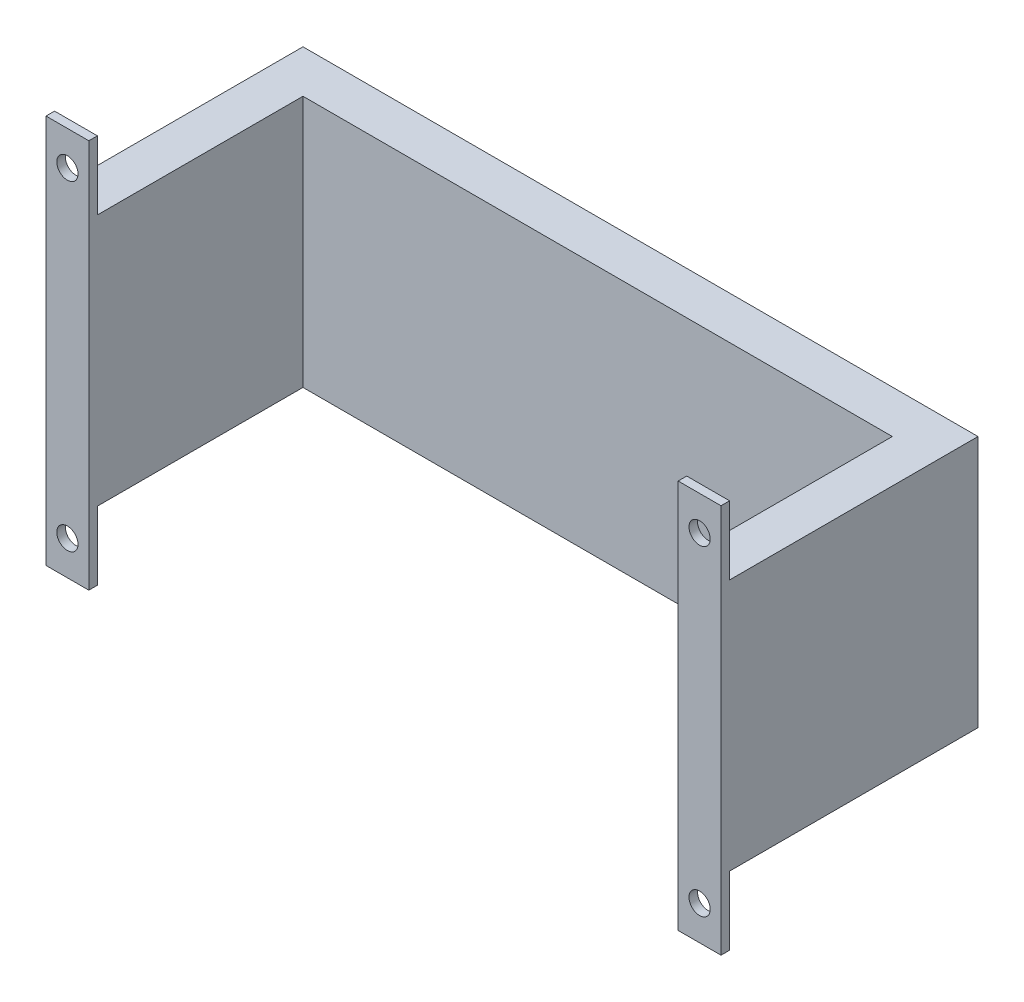
ISO-10303-21;
HEADER;
FILE_DESCRIPTION(('STEP AP214'),'2;1');
FILE_NAME('part.step','',(''),(''),'','','');
FILE_SCHEMA(('AUTOMOTIVE_DESIGN { 1 0 10303 214 1 1 1 1 }'));
ENDSEC;
DATA;
#1=APPLICATION_CONTEXT('core data for automotive mechanical design processes');
#2=APPLICATION_PROTOCOL_DEFINITION('international standard','automotive_design',2000,#1);
#3=PRODUCT_CONTEXT('',#1,'mechanical');
#4=PRODUCT('Part','Part','',(#3));
#5=PRODUCT_RELATED_PRODUCT_CATEGORY('part','',(#4));
#6=PRODUCT_DEFINITION_FORMATION('','',#4);
#7=PRODUCT_DEFINITION_CONTEXT('part definition',#1,'design');
#8=PRODUCT_DEFINITION('design','',#6,#7);
#9=PRODUCT_DEFINITION_SHAPE('','',#8);
#10=(LENGTH_UNIT() NAMED_UNIT(*) SI_UNIT(.MILLI.,.METRE.));
#11=(NAMED_UNIT(*) PLANE_ANGLE_UNIT() SI_UNIT($,.RADIAN.));
#12=(NAMED_UNIT(*) SI_UNIT($,.STERADIAN.) SOLID_ANGLE_UNIT());
#13=UNCERTAINTY_MEASURE_WITH_UNIT(LENGTH_MEASURE(1.E-05),#10,'distance_accuracy_value','');
#14=(GEOMETRIC_REPRESENTATION_CONTEXT(3) GLOBAL_UNCERTAINTY_ASSIGNED_CONTEXT((#13)) GLOBAL_UNIT_ASSIGNED_CONTEXT((#10,
#11,#12)) REPRESENTATION_CONTEXT('',''));
#15=CARTESIAN_POINT('',(0.,0.,0.));
#16=DIRECTION('',(0.,0.,1.));
#17=DIRECTION('',(1.,0.,0.));
#18=AXIS2_PLACEMENT_3D('',#15,#16,#17);
#19=CARTESIAN_POINT('',(0.,0.,95.25));
#20=DIRECTION('',(0.,0.,1.));
#21=DIRECTION('',(1.,0.,0.));
#22=AXIS2_PLACEMENT_3D('',#19,#20,#21);
#23=PLANE('',#22);
#24=CARTESIAN_POINT('',(-117.1575,-59.436,95.25));
#25=DIRECTION('',(0.,0.,-1.));
#26=DIRECTION('',(1.,0.,0.));
#27=AXIS2_PLACEMENT_3D('',#24,#25,#26);
#28=CIRCLE('',#27,3.937);
#29=CARTESIAN_POINT('',(-113.2205,-59.436,95.25));
#30=VERTEX_POINT('',#29);
#31=EDGE_CURVE('E428',#30,#30,#28,.T.);
#32=ORIENTED_EDGE('',*,*,#31,.T.);
#33=EDGE_LOOP('',(#32));
#34=FACE_BOUND('',#33,.T.);
#35=CARTESIAN_POINT('',(-117.1575,59.436,95.25));
#36=DIRECTION('',(0.,0.,-1.));
#37=DIRECTION('',(-1.,0.,0.));
#38=AXIS2_PLACEMENT_3D('',#35,#36,#37);
#39=CIRCLE('',#38,3.937);
#40=CARTESIAN_POINT('',(-121.0945,59.436,95.25));
#41=VERTEX_POINT('',#40);
#42=EDGE_CURVE('E180',#41,#41,#39,.T.);
#43=ORIENTED_EDGE('',*,*,#42,.T.);
#44=EDGE_LOOP('',(#43));
#45=FACE_BOUND('',#44,.T.);
#46=DIRECTION('',(0.,-1.,0.));
#47=VECTOR('',#46,1.);
#48=CARTESIAN_POINT('',(-109.22,-46.736,95.25));
#49=LINE('',#48,#47);
#50=CARTESIAN_POINT('',(-109.22,72.136,95.25));
#51=VERTEX_POINT('',#50);
#52=CARTESIAN_POINT('',(-109.22,-72.136,95.25));
#53=VERTEX_POINT('',#52);
#54=EDGE_CURVE('E272',#51,#53,#49,.T.);
#55=ORIENTED_EDGE('',*,*,#54,.F.);
#56=DIRECTION('',(-1.,0.,0.));
#57=VECTOR('',#56,1.);
#58=CARTESIAN_POINT('',(-109.22,72.136,95.25));
#59=LINE('',#58,#57);
#60=CARTESIAN_POINT('',(-125.095,72.136,95.25));
#61=VERTEX_POINT('',#60);
#62=EDGE_CURVE('E166',#51,#61,#59,.T.);
#63=ORIENTED_EDGE('',*,*,#62,.T.);
#64=DIRECTION('',(0.,-1.,0.));
#65=VECTOR('',#64,1.);
#66=CARTESIAN_POINT('',(-125.095,-46.736,95.25));
#67=LINE('',#66,#65);
#68=CARTESIAN_POINT('',(-125.095,-72.136,95.25));
#69=VERTEX_POINT('',#68);
#70=EDGE_CURVE('E161',#61,#69,#67,.T.);
#71=ORIENTED_EDGE('',*,*,#70,.T.);
#72=DIRECTION('',(1.,0.,0.));
#73=VECTOR('',#72,1.);
#74=CARTESIAN_POINT('',(-109.22,-72.136,95.25));
#75=LINE('',#74,#73);
#76=EDGE_CURVE('E164',#69,#53,#75,.T.);
#77=ORIENTED_EDGE('',*,*,#76,.T.);
#78=EDGE_LOOP('',(#55,#63,#71,#77));
#79=FACE_BOUND('',#78,.T.);
#80=ADVANCED_FACE('F45',(#34,#45,#79),#23,.T.);
#81=CARTESIAN_POINT('',(-125.095,-46.736,95.25));
#82=DIRECTION('',(1.,0.,0.));
#83=DIRECTION('',(0.,0.,-1.));
#84=AXIS2_PLACEMENT_3D('',#81,#82,#83);
#85=PLANE('',#84);
#86=DIRECTION('',(0.,-1.,0.));
#87=VECTOR('',#86,1.);
#88=CARTESIAN_POINT('',(-125.095,-46.736,0.));
#89=LINE('',#88,#87);
#90=CARTESIAN_POINT('',(-125.095,46.736,0.));
#91=VERTEX_POINT('',#90);
#92=CARTESIAN_POINT('',(-125.095,-46.736,0.));
#93=VERTEX_POINT('',#92);
#94=EDGE_CURVE('E302',#91,#93,#89,.T.);
#95=ORIENTED_EDGE('',*,*,#94,.T.);
#96=DIRECTION('',(0.,0.,-1.));
#97=VECTOR('',#96,1.);
#98=CARTESIAN_POINT('',(-125.095,-46.736,95.25));
#99=LINE('',#98,#97);
#100=CARTESIAN_POINT('',(-125.095,-46.736,92.075));
#101=VERTEX_POINT('',#100);
#102=EDGE_CURVE('E11',#101,#93,#99,.T.);
#103=ORIENTED_EDGE('',*,*,#102,.F.);
#104=DIRECTION('',(0.,-1.,0.));
#105=VECTOR('',#104,1.);
#106=CARTESIAN_POINT('',(-125.095,-72.136,92.075));
#107=LINE('',#106,#105);
#108=CARTESIAN_POINT('',(-125.095,-72.136,92.075));
#109=VERTEX_POINT('',#108);
#110=EDGE_CURVE('E69',#101,#109,#107,.T.);
#111=ORIENTED_EDGE('',*,*,#110,.T.);
#112=DIRECTION('',(0.,0.,1.));
#113=VECTOR('',#112,1.);
#114=CARTESIAN_POINT('',(-125.095,-72.136,92.075));
#115=LINE('',#114,#113);
#116=EDGE_CURVE('E173',#109,#69,#115,.T.);
#117=ORIENTED_EDGE('',*,*,#116,.T.);
#118=ORIENTED_EDGE('',*,*,#70,.F.);
#119=DIRECTION('',(0.,0.,1.));
#120=VECTOR('',#119,1.);
#121=CARTESIAN_POINT('',(-125.095,72.136,92.075));
#122=LINE('',#121,#120);
#123=CARTESIAN_POINT('',(-125.095,72.136,92.075));
#124=VERTEX_POINT('',#123);
#125=EDGE_CURVE('E210',#124,#61,#122,.T.);
#126=ORIENTED_EDGE('',*,*,#125,.F.);
#127=DIRECTION('',(0.,-1.,0.));
#128=VECTOR('',#127,1.);
#129=CARTESIAN_POINT('',(-125.095,72.136,92.075));
#130=LINE('',#129,#128);
#131=CARTESIAN_POINT('',(-125.095,46.736,92.075));
#132=VERTEX_POINT('',#131);
#133=EDGE_CURVE('E221',#124,#132,#130,.T.);
#134=ORIENTED_EDGE('',*,*,#133,.T.);
#135=DIRECTION('',(0.,0.,-1.));
#136=VECTOR('',#135,1.);
#137=CARTESIAN_POINT('',(-125.095,46.736,95.25));
#138=LINE('',#137,#136);
#139=EDGE_CURVE('E316',#132,#91,#138,.T.);
#140=ORIENTED_EDGE('',*,*,#139,.T.);
#141=EDGE_LOOP('',(#95,#103,#111,#117,#118,#126,#134,#140));
#142=FACE_BOUND('',#141,.T.);
#143=ADVANCED_FACE('F47',(#142),#85,.F.);
#144=CARTESIAN_POINT('',(125.095,-46.736,95.25));
#145=DIRECTION('',(0.,1.,0.));
#146=DIRECTION('',(-1.,0.,0.));
#147=AXIS2_PLACEMENT_3D('',#144,#145,#146);
#148=PLANE('',#147);
#149=DIRECTION('',(0.,0.,-1.));
#150=VECTOR('',#149,1.);
#151=CARTESIAN_POINT('',(125.095,-46.736,95.25));
#152=LINE('',#151,#150);
#153=CARTESIAN_POINT('',(125.095,-46.736,92.075));
#154=VERTEX_POINT('',#153);
#155=CARTESIAN_POINT('',(125.095,-46.736,0.));
#156=VERTEX_POINT('',#155);
#157=EDGE_CURVE('E54',#154,#156,#152,.T.);
#158=ORIENTED_EDGE('',*,*,#157,.F.);
#159=DIRECTION('',(-1.,0.,0.));
#160=VECTOR('',#159,1.);
#161=CARTESIAN_POINT('',(109.22,-46.736,92.075));
#162=LINE('',#161,#160);
#163=CARTESIAN_POINT('',(109.22,-46.736,92.075));
#164=VERTEX_POINT('',#163);
#165=EDGE_CURVE('E233',#154,#164,#162,.T.);
#166=ORIENTED_EDGE('',*,*,#165,.T.);
#167=DIRECTION('',(0.,0.,1.));
#168=VECTOR('',#167,1.);
#169=CARTESIAN_POINT('',(109.22,-46.736,15.875));
#170=LINE('',#169,#168);
#171=CARTESIAN_POINT('',(109.22,-46.736,15.875));
#172=VERTEX_POINT('',#171);
#173=EDGE_CURVE('E307',#172,#164,#170,.T.);
#174=ORIENTED_EDGE('',*,*,#173,.F.);
#175=DIRECTION('',(1.,0.,0.));
#176=VECTOR('',#175,1.);
#177=CARTESIAN_POINT('',(109.22,-46.736,15.875));
#178=LINE('',#177,#176);
#179=CARTESIAN_POINT('',(-109.22,-46.736,15.875));
#180=VERTEX_POINT('',#179);
#181=EDGE_CURVE('E280',#180,#172,#178,.T.);
#182=ORIENTED_EDGE('',*,*,#181,.F.);
#183=DIRECTION('',(0.,0.,1.));
#184=VECTOR('',#183,1.);
#185=CARTESIAN_POINT('',(-109.22,-46.736,15.875));
#186=LINE('',#185,#184);
#187=CARTESIAN_POINT('',(-109.22,-46.736,92.075));
#188=VERTEX_POINT('',#187);
#189=EDGE_CURVE('E293',#180,#188,#186,.T.);
#190=ORIENTED_EDGE('',*,*,#189,.T.);
#191=DIRECTION('',(-1.,0.,0.));
#192=VECTOR('',#191,1.);
#193=CARTESIAN_POINT('',(-109.22,-46.736,92.075));
#194=LINE('',#193,#192);
#195=EDGE_CURVE('E199',#188,#101,#194,.T.);
#196=ORIENTED_EDGE('',*,*,#195,.T.);
#197=ORIENTED_EDGE('',*,*,#102,.T.);
#198=DIRECTION('',(1.,0.,0.));
#199=VECTOR('',#198,1.);
#200=CARTESIAN_POINT('',(125.095,-46.736,0.));
#201=LINE('',#200,#199);
#202=EDGE_CURVE('E319',#93,#156,#201,.T.);
#203=ORIENTED_EDGE('',*,*,#202,.T.);
#204=EDGE_LOOP('',(#158,#166,#174,#182,#190,#196,#197,#203));
#205=FACE_BOUND('',#204,.T.);
#206=ADVANCED_FACE('F344',(#205),#148,.F.);
#207=CARTESIAN_POINT('',(125.095,-46.736,95.25));
#208=DIRECTION('',(-1.,0.,0.));
#209=DIRECTION('',(0.,0.,1.));
#210=AXIS2_PLACEMENT_3D('',#207,#208,#209);
#211=PLANE('',#210);
#212=DIRECTION('',(0.,1.,0.));
#213=VECTOR('',#212,1.);
#214=CARTESIAN_POINT('',(125.095,-46.736,0.));
#215=LINE('',#214,#213);
#216=CARTESIAN_POINT('',(125.095,46.736,0.));
#217=VERTEX_POINT('',#216);
#218=EDGE_CURVE('E323',#156,#217,#215,.T.);
#219=ORIENTED_EDGE('',*,*,#218,.T.);
#220=DIRECTION('',(0.,0.,-1.));
#221=VECTOR('',#220,1.);
#222=CARTESIAN_POINT('',(125.095,46.736,95.25));
#223=LINE('',#222,#221);
#224=CARTESIAN_POINT('',(125.095,46.736,92.075));
#225=VERTEX_POINT('',#224);
#226=EDGE_CURVE('E332',#225,#217,#223,.T.);
#227=ORIENTED_EDGE('',*,*,#226,.F.);
#228=DIRECTION('',(0.,1.,0.));
#229=VECTOR('',#228,1.);
#230=CARTESIAN_POINT('',(125.095,72.136,92.075));
#231=LINE('',#230,#229);
#232=CARTESIAN_POINT('',(125.095,72.136,92.075));
#233=VERTEX_POINT('',#232);
#234=EDGE_CURVE('E249',#225,#233,#231,.T.);
#235=ORIENTED_EDGE('',*,*,#234,.T.);
#236=DIRECTION('',(0.,0.,1.));
#237=VECTOR('',#236,1.);
#238=CARTESIAN_POINT('',(125.095,72.136,92.075));
#239=LINE('',#238,#237);
#240=CARTESIAN_POINT('',(125.095,72.136,95.25));
#241=VERTEX_POINT('',#240);
#242=EDGE_CURVE('E264',#233,#241,#239,.T.);
#243=ORIENTED_EDGE('',*,*,#242,.T.);
#244=DIRECTION('',(0.,1.,0.));
#245=VECTOR('',#244,1.);
#246=CARTESIAN_POINT('',(125.095,-46.736,95.25));
#247=LINE('',#246,#245);
#248=CARTESIAN_POINT('',(125.095,-72.136,95.25));
#249=VERTEX_POINT('',#248);
#250=EDGE_CURVE('E170',#249,#241,#247,.T.);
#251=ORIENTED_EDGE('',*,*,#250,.F.);
#252=DIRECTION('',(0.,0.,1.));
#253=VECTOR('',#252,1.);
#254=CARTESIAN_POINT('',(125.095,-72.136,92.075));
#255=LINE('',#254,#253);
#256=CARTESIAN_POINT('',(125.095,-72.136,92.075));
#257=VERTEX_POINT('',#256);
#258=EDGE_CURVE('E185',#257,#249,#255,.T.);
#259=ORIENTED_EDGE('',*,*,#258,.F.);
#260=DIRECTION('',(0.,1.,0.));
#261=VECTOR('',#260,1.);
#262=CARTESIAN_POINT('',(125.095,-72.136,92.075));
#263=LINE('',#262,#261);
#264=EDGE_CURVE('E240',#257,#154,#263,.T.);
#265=ORIENTED_EDGE('',*,*,#264,.T.);
#266=ORIENTED_EDGE('',*,*,#157,.T.);
#267=EDGE_LOOP('',(#219,#227,#235,#243,#251,#259,#265,#266));
#268=FACE_BOUND('',#267,.T.);
#269=ADVANCED_FACE('F337',(#268),#211,.F.);
#270=CARTESIAN_POINT('',(125.095,46.736,95.25));
#271=DIRECTION('',(0.,-1.,0.));
#272=DIRECTION('',(1.,0.,0.));
#273=AXIS2_PLACEMENT_3D('',#270,#271,#272);
#274=PLANE('',#273);
#275=ORIENTED_EDGE('',*,*,#139,.F.);
#276=DIRECTION('',(1.,0.,0.));
#277=VECTOR('',#276,1.);
#278=CARTESIAN_POINT('',(-109.22,46.736,92.075));
#279=LINE('',#278,#277);
#280=CARTESIAN_POINT('',(-109.22,46.736,92.075));
#281=VERTEX_POINT('',#280);
#282=EDGE_CURVE('E209',#132,#281,#279,.T.);
#283=ORIENTED_EDGE('',*,*,#282,.T.);
#284=DIRECTION('',(0.,0.,1.));
#285=VECTOR('',#284,1.);
#286=CARTESIAN_POINT('',(-109.22,46.736,15.875));
#287=LINE('',#286,#285);
#288=CARTESIAN_POINT('',(-109.22,46.736,15.875));
#289=VERTEX_POINT('',#288);
#290=EDGE_CURVE('E298',#289,#281,#287,.T.);
#291=ORIENTED_EDGE('',*,*,#290,.F.);
#292=DIRECTION('',(-1.,0.,0.));
#293=VECTOR('',#292,1.);
#294=CARTESIAN_POINT('',(109.22,46.736,15.875));
#295=LINE('',#294,#293);
#296=CARTESIAN_POINT('',(109.22,46.736,15.875));
#297=VERTEX_POINT('',#296);
#298=EDGE_CURVE('E289',#297,#289,#295,.T.);
#299=ORIENTED_EDGE('',*,*,#298,.F.);
#300=DIRECTION('',(0.,0.,1.));
#301=VECTOR('',#300,1.);
#302=CARTESIAN_POINT('',(109.22,46.736,15.875));
#303=LINE('',#302,#301);
#304=CARTESIAN_POINT('',(109.22,46.736,92.075));
#305=VERTEX_POINT('',#304);
#306=EDGE_CURVE('E303',#297,#305,#303,.T.);
#307=ORIENTED_EDGE('',*,*,#306,.T.);
#308=DIRECTION('',(1.,0.,0.));
#309=VECTOR('',#308,1.);
#310=CARTESIAN_POINT('',(109.22,46.736,92.075));
#311=LINE('',#310,#309);
#312=EDGE_CURVE('E260',#305,#225,#311,.T.);
#313=ORIENTED_EDGE('',*,*,#312,.T.);
#314=ORIENTED_EDGE('',*,*,#226,.T.);
#315=DIRECTION('',(-1.,0.,0.));
#316=VECTOR('',#315,1.);
#317=CARTESIAN_POINT('',(125.095,46.736,0.));
#318=LINE('',#317,#316);
#319=EDGE_CURVE('E171',#217,#91,#318,.T.);
#320=ORIENTED_EDGE('',*,*,#319,.T.);
#321=EDGE_LOOP('',(#275,#283,#291,#299,#307,#313,#314,#320));
#322=FACE_BOUND('',#321,.T.);
#323=ADVANCED_FACE('F350',(#322),#274,.F.);
#324=CARTESIAN_POINT('',(117.1575,59.436,95.25));
#325=DIRECTION('',(0.,0.,-1.));
#326=DIRECTION('',(1.,0.,0.));
#327=AXIS2_PLACEMENT_3D('',#324,#325,#326);
#328=CIRCLE('',#327,3.937);
#329=CARTESIAN_POINT('',(121.0945,59.436,95.25));
#330=VERTEX_POINT('',#329);
#331=EDGE_CURVE('E418',#330,#330,#328,.T.);
#332=ORIENTED_EDGE('',*,*,#331,.T.);
#333=EDGE_LOOP('',(#332));
#334=FACE_BOUND('',#333,.T.);
#335=CARTESIAN_POINT('',(117.1575,-59.436,95.25));
#336=DIRECTION('',(0.,0.,-1.));
#337=DIRECTION('',(-1.,0.,0.));
#338=AXIS2_PLACEMENT_3D('',#335,#336,#337);
#339=CIRCLE('',#338,3.937);
#340=CARTESIAN_POINT('',(113.2205,-59.436,95.25));
#341=VERTEX_POINT('',#340);
#342=EDGE_CURVE('E421',#341,#341,#339,.T.);
#343=ORIENTED_EDGE('',*,*,#342,.T.);
#344=EDGE_LOOP('',(#343));
#345=FACE_BOUND('',#344,.T.);
#346=DIRECTION('',(0.,1.,0.));
#347=VECTOR('',#346,1.);
#348=CARTESIAN_POINT('',(109.22,-46.736,95.25));
#349=LINE('',#348,#347);
#350=CARTESIAN_POINT('',(109.22,-72.136,95.25));
#351=VERTEX_POINT('',#350);
#352=CARTESIAN_POINT('',(109.22,72.136,95.25));
#353=VERTEX_POINT('',#352);
#354=EDGE_CURVE('E281',#351,#353,#349,.T.);
#355=ORIENTED_EDGE('',*,*,#354,.F.);
#356=DIRECTION('',(1.,0.,0.));
#357=VECTOR('',#356,1.);
#358=CARTESIAN_POINT('',(109.22,-72.136,95.25));
#359=LINE('',#358,#357);
#360=EDGE_CURVE('E213',#351,#249,#359,.T.);
#361=ORIENTED_EDGE('',*,*,#360,.T.);
#362=ORIENTED_EDGE('',*,*,#250,.T.);
#363=DIRECTION('',(-1.,0.,0.));
#364=VECTOR('',#363,1.);
#365=CARTESIAN_POINT('',(109.22,72.136,95.25));
#366=LINE('',#365,#364);
#367=EDGE_CURVE('E216',#241,#353,#366,.T.);
#368=ORIENTED_EDGE('',*,*,#367,.T.);
#369=EDGE_LOOP('',(#355,#361,#362,#368));
#370=FACE_BOUND('',#369,.T.);
#371=ADVANCED_FACE('F360',(#334,#345,#370),#23,.T.);
#372=CARTESIAN_POINT('',(0.,0.,0.));
#373=DIRECTION('',(0.,0.,1.));
#374=DIRECTION('',(1.,0.,0.));
#375=AXIS2_PLACEMENT_3D('',#372,#373,#374);
#376=PLANE('',#375);
#377=ORIENTED_EDGE('',*,*,#94,.F.);
#378=ORIENTED_EDGE('',*,*,#319,.F.);
#379=ORIENTED_EDGE('',*,*,#218,.F.);
#380=ORIENTED_EDGE('',*,*,#202,.F.);
#381=EDGE_LOOP('',(#377,#378,#379,#380));
#382=FACE_BOUND('',#381,.T.);
#383=ADVANCED_FACE('F347',(#382),#376,.F.);
#384=CARTESIAN_POINT('',(-109.22,-46.736,15.875));
#385=DIRECTION('',(-1.,0.,0.));
#386=DIRECTION('',(0.,0.,1.));
#387=AXIS2_PLACEMENT_3D('',#384,#385,#386);
#388=PLANE('',#387);
#389=ORIENTED_EDGE('',*,*,#54,.T.);
#390=DIRECTION('',(0.,0.,1.));
#391=VECTOR('',#390,1.);
#392=CARTESIAN_POINT('',(-109.22,-72.136,92.075));
#393=LINE('',#392,#391);
#394=CARTESIAN_POINT('',(-109.22,-72.136,92.075));
#395=VERTEX_POINT('',#394);
#396=EDGE_CURVE('E179',#395,#53,#393,.T.);
#397=ORIENTED_EDGE('',*,*,#396,.F.);
#398=DIRECTION('',(0.,1.,0.));
#399=VECTOR('',#398,1.);
#400=CARTESIAN_POINT('',(-109.22,-72.136,92.075));
#401=LINE('',#400,#399);
#402=EDGE_CURVE('E193',#395,#188,#401,.T.);
#403=ORIENTED_EDGE('',*,*,#402,.T.);
#404=ORIENTED_EDGE('',*,*,#189,.F.);
#405=DIRECTION('',(0.,-1.,0.));
#406=VECTOR('',#405,1.);
#407=CARTESIAN_POINT('',(-109.22,-46.736,15.875));
#408=LINE('',#407,#406);
#409=EDGE_CURVE('E276',#289,#180,#408,.T.);
#410=ORIENTED_EDGE('',*,*,#409,.F.);
#411=ORIENTED_EDGE('',*,*,#290,.T.);
#412=DIRECTION('',(0.,1.,0.));
#413=VECTOR('',#412,1.);
#414=CARTESIAN_POINT('',(-109.22,72.136,92.075));
#415=LINE('',#414,#413);
#416=CARTESIAN_POINT('',(-109.22,72.136,92.075));
#417=VERTEX_POINT('',#416);
#418=EDGE_CURVE('E217',#281,#417,#415,.T.);
#419=ORIENTED_EDGE('',*,*,#418,.T.);
#420=DIRECTION('',(0.,0.,1.));
#421=VECTOR('',#420,1.);
#422=CARTESIAN_POINT('',(-109.22,72.136,92.075));
#423=LINE('',#422,#421);
#424=EDGE_CURVE('E205',#417,#51,#423,.T.);
#425=ORIENTED_EDGE('',*,*,#424,.T.);
#426=EDGE_LOOP('',(#389,#397,#403,#404,#410,#411,#419,#425));
#427=FACE_BOUND('',#426,.T.);
#428=ADVANCED_FACE('F374',(#427),#388,.F.);
#429=CARTESIAN_POINT('',(109.22,-46.736,15.875));
#430=DIRECTION('',(1.,0.,0.));
#431=DIRECTION('',(0.,0.,-1.));
#432=AXIS2_PLACEMENT_3D('',#429,#430,#431);
#433=PLANE('',#432);
#434=ORIENTED_EDGE('',*,*,#354,.T.);
#435=DIRECTION('',(0.,0.,1.));
#436=VECTOR('',#435,1.);
#437=CARTESIAN_POINT('',(109.22,72.136,92.075));
#438=LINE('',#437,#436);
#439=CARTESIAN_POINT('',(109.22,72.136,92.075));
#440=VERTEX_POINT('',#439);
#441=EDGE_CURVE('E268',#440,#353,#438,.T.);
#442=ORIENTED_EDGE('',*,*,#441,.F.);
#443=DIRECTION('',(0.,-1.,0.));
#444=VECTOR('',#443,1.);
#445=CARTESIAN_POINT('',(109.22,72.136,92.075));
#446=LINE('',#445,#444);
#447=EDGE_CURVE('E257',#440,#305,#446,.T.);
#448=ORIENTED_EDGE('',*,*,#447,.T.);
#449=ORIENTED_EDGE('',*,*,#306,.F.);
#450=DIRECTION('',(0.,1.,0.));
#451=VECTOR('',#450,1.);
#452=CARTESIAN_POINT('',(109.22,-46.736,15.875));
#453=LINE('',#452,#451);
#454=EDGE_CURVE('E285',#172,#297,#453,.T.);
#455=ORIENTED_EDGE('',*,*,#454,.F.);
#456=ORIENTED_EDGE('',*,*,#173,.T.);
#457=DIRECTION('',(0.,-1.,0.));
#458=VECTOR('',#457,1.);
#459=CARTESIAN_POINT('',(109.22,-72.136,92.075));
#460=LINE('',#459,#458);
#461=CARTESIAN_POINT('',(109.22,-72.136,92.075));
#462=VERTEX_POINT('',#461);
#463=EDGE_CURVE('E61',#164,#462,#460,.T.);
#464=ORIENTED_EDGE('',*,*,#463,.T.);
#465=DIRECTION('',(0.,0.,1.));
#466=VECTOR('',#465,1.);
#467=CARTESIAN_POINT('',(109.22,-72.136,92.075));
#468=LINE('',#467,#466);
#469=EDGE_CURVE('E191',#462,#351,#468,.T.);
#470=ORIENTED_EDGE('',*,*,#469,.T.);
#471=EDGE_LOOP('',(#434,#442,#448,#449,#455,#456,#464,#470));
#472=FACE_BOUND('',#471,.T.);
#473=ADVANCED_FACE('F366',(#472),#433,.F.);
#474=CARTESIAN_POINT('',(0.,0.,15.875));
#475=DIRECTION('',(0.,0.,1.));
#476=DIRECTION('',(1.,0.,0.));
#477=AXIS2_PLACEMENT_3D('',#474,#475,#476);
#478=PLANE('',#477);
#479=ORIENTED_EDGE('',*,*,#409,.T.);
#480=ORIENTED_EDGE('',*,*,#181,.T.);
#481=ORIENTED_EDGE('',*,*,#454,.T.);
#482=ORIENTED_EDGE('',*,*,#298,.T.);
#483=EDGE_LOOP('',(#479,#480,#481,#482));
#484=FACE_BOUND('',#483,.T.);
#485=ADVANCED_FACE('F370',(#484),#478,.T.);
#486=CARTESIAN_POINT('',(109.22,72.136,92.075));
#487=DIRECTION('',(0.,1.,0.));
#488=DIRECTION('',(0.,0.,1.));
#489=AXIS2_PLACEMENT_3D('',#486,#487,#488);
#490=PLANE('',#489);
#491=ORIENTED_EDGE('',*,*,#367,.F.);
#492=ORIENTED_EDGE('',*,*,#242,.F.);
#493=DIRECTION('',(-1.,0.,0.));
#494=VECTOR('',#493,1.);
#495=CARTESIAN_POINT('',(109.22,72.136,92.075));
#496=LINE('',#495,#494);
#497=EDGE_CURVE('E253',#233,#440,#496,.T.);
#498=ORIENTED_EDGE('',*,*,#497,.T.);
#499=ORIENTED_EDGE('',*,*,#441,.T.);
#500=EDGE_LOOP('',(#491,#492,#498,#499));
#501=FACE_BOUND('',#500,.T.);
#502=ADVANCED_FACE('F358',(#501),#490,.T.);
#503=CARTESIAN_POINT('',(0.,0.,92.075));
#504=DIRECTION('',(0.,0.,1.));
#505=DIRECTION('',(1.,0.,0.));
#506=AXIS2_PLACEMENT_3D('',#503,#504,#505);
#507=PLANE('',#506);
#508=CARTESIAN_POINT('',(117.1575,59.436,92.075));
#509=DIRECTION('',(0.,0.,-1.));
#510=DIRECTION('',(1.,0.,0.));
#511=AXIS2_PLACEMENT_3D('',#508,#509,#510);
#512=CIRCLE('',#511,3.937);
#513=CARTESIAN_POINT('',(121.0945,59.436,92.075));
#514=VERTEX_POINT('',#513);
#515=EDGE_CURVE('E431',#514,#514,#512,.T.);
#516=ORIENTED_EDGE('',*,*,#515,.F.);
#517=EDGE_LOOP('',(#516));
#518=FACE_BOUND('',#517,.T.);
#519=ORIENTED_EDGE('',*,*,#234,.F.);
#520=ORIENTED_EDGE('',*,*,#312,.F.);
#521=ORIENTED_EDGE('',*,*,#447,.F.);
#522=ORIENTED_EDGE('',*,*,#497,.F.);
#523=EDGE_LOOP('',(#519,#520,#521,#522));
#524=FACE_BOUND('',#523,.T.);
#525=ADVANCED_FACE('F355',(#518,#524),#507,.F.);
#526=CARTESIAN_POINT('',(-109.22,72.136,92.075));
#527=DIRECTION('',(0.,1.,0.));
#528=DIRECTION('',(0.,0.,1.));
#529=AXIS2_PLACEMENT_3D('',#526,#527,#528);
#530=PLANE('',#529);
#531=ORIENTED_EDGE('',*,*,#62,.F.);
#532=ORIENTED_EDGE('',*,*,#424,.F.);
#533=DIRECTION('',(-1.,0.,0.));
#534=VECTOR('',#533,1.);
#535=CARTESIAN_POINT('',(-109.22,72.136,92.075));
#536=LINE('',#535,#534);
#537=EDGE_CURVE('E224',#417,#124,#536,.T.);
#538=ORIENTED_EDGE('',*,*,#537,.T.);
#539=ORIENTED_EDGE('',*,*,#125,.T.);
#540=EDGE_LOOP('',(#531,#532,#538,#539));
#541=FACE_BOUND('',#540,.T.);
#542=ADVANCED_FACE('F383',(#541),#530,.T.);
#543=CARTESIAN_POINT('',(0.,0.,92.075));
#544=DIRECTION('',(0.,0.,-1.));
#545=DIRECTION('',(-1.,0.,0.));
#546=AXIS2_PLACEMENT_3D('',#543,#544,#545);
#547=PLANE('',#546);
#548=CARTESIAN_POINT('',(-117.1575,59.436,92.075));
#549=DIRECTION('',(0.,0.,-1.));
#550=DIRECTION('',(-1.,0.,0.));
#551=AXIS2_PLACEMENT_3D('',#548,#549,#550);
#552=CIRCLE('',#551,3.937);
#553=CARTESIAN_POINT('',(-121.0945,59.436,92.075));
#554=VERTEX_POINT('',#553);
#555=EDGE_CURVE('E435',#554,#554,#552,.T.);
#556=ORIENTED_EDGE('',*,*,#555,.F.);
#557=EDGE_LOOP('',(#556));
#558=FACE_BOUND('',#557,.T.);
#559=ORIENTED_EDGE('',*,*,#418,.F.);
#560=ORIENTED_EDGE('',*,*,#282,.F.);
#561=ORIENTED_EDGE('',*,*,#133,.F.);
#562=ORIENTED_EDGE('',*,*,#537,.F.);
#563=EDGE_LOOP('',(#559,#560,#561,#562));
#564=FACE_BOUND('',#563,.T.);
#565=ADVANCED_FACE('F381',(#558,#564),#547,.T.);
#566=CARTESIAN_POINT('',(-109.22,-72.136,92.075));
#567=DIRECTION('',(0.,-1.,0.));
#568=DIRECTION('',(0.,0.,-1.));
#569=AXIS2_PLACEMENT_3D('',#566,#567,#568);
#570=PLANE('',#569);
#571=ORIENTED_EDGE('',*,*,#76,.F.);
#572=ORIENTED_EDGE('',*,*,#116,.F.);
#573=DIRECTION('',(1.,0.,0.));
#574=VECTOR('',#573,1.);
#575=CARTESIAN_POINT('',(-109.22,-72.136,92.075));
#576=LINE('',#575,#574);
#577=EDGE_CURVE('E186',#109,#395,#576,.T.);
#578=ORIENTED_EDGE('',*,*,#577,.T.);
#579=ORIENTED_EDGE('',*,*,#396,.T.);
#580=EDGE_LOOP('',(#571,#572,#578,#579));
#581=FACE_BOUND('',#580,.T.);
#582=ADVANCED_FACE('F183',(#581),#570,.T.);
#583=CARTESIAN_POINT('',(0.,0.,92.075));
#584=DIRECTION('',(0.,0.,-1.));
#585=DIRECTION('',(-1.,0.,0.));
#586=AXIS2_PLACEMENT_3D('',#583,#584,#585);
#587=PLANE('',#586);
#588=CARTESIAN_POINT('',(-117.1575,-59.436,92.075));
#589=DIRECTION('',(0.,0.,-1.));
#590=DIRECTION('',(1.,0.,0.));
#591=AXIS2_PLACEMENT_3D('',#588,#589,#590);
#592=CIRCLE('',#591,3.937);
#593=CARTESIAN_POINT('',(-113.2205,-59.436,92.075));
#594=VERTEX_POINT('',#593);
#595=EDGE_CURVE('E438',#594,#594,#592,.T.);
#596=ORIENTED_EDGE('',*,*,#595,.F.);
#597=EDGE_LOOP('',(#596));
#598=FACE_BOUND('',#597,.T.);
#599=ORIENTED_EDGE('',*,*,#577,.F.);
#600=ORIENTED_EDGE('',*,*,#110,.F.);
#601=ORIENTED_EDGE('',*,*,#195,.F.);
#602=ORIENTED_EDGE('',*,*,#402,.F.);
#603=EDGE_LOOP('',(#599,#600,#601,#602));
#604=FACE_BOUND('',#603,.T.);
#605=ADVANCED_FACE('F376',(#598,#604),#587,.T.);
#606=CARTESIAN_POINT('',(109.22,-72.136,92.075));
#607=DIRECTION('',(0.,-1.,0.));
#608=DIRECTION('',(0.,0.,-1.));
#609=AXIS2_PLACEMENT_3D('',#606,#607,#608);
#610=PLANE('',#609);
#611=ORIENTED_EDGE('',*,*,#360,.F.);
#612=ORIENTED_EDGE('',*,*,#469,.F.);
#613=DIRECTION('',(1.,0.,0.));
#614=VECTOR('',#613,1.);
#615=CARTESIAN_POINT('',(109.22,-72.136,92.075));
#616=LINE('',#615,#614);
#617=EDGE_CURVE('E243',#462,#257,#616,.T.);
#618=ORIENTED_EDGE('',*,*,#617,.T.);
#619=ORIENTED_EDGE('',*,*,#258,.T.);
#620=EDGE_LOOP('',(#611,#612,#618,#619));
#621=FACE_BOUND('',#620,.T.);
#622=ADVANCED_FACE('F363',(#621),#610,.T.);
#623=CARTESIAN_POINT('',(0.,0.,92.075));
#624=DIRECTION('',(0.,0.,-1.));
#625=DIRECTION('',(-1.,0.,0.));
#626=AXIS2_PLACEMENT_3D('',#623,#624,#625);
#627=PLANE('',#626);
#628=CARTESIAN_POINT('',(117.1575,-59.436,92.075));
#629=DIRECTION('',(0.,0.,-1.));
#630=DIRECTION('',(-1.,0.,0.));
#631=AXIS2_PLACEMENT_3D('',#628,#629,#630);
#632=CIRCLE('',#631,3.937);
#633=CARTESIAN_POINT('',(113.2205,-59.436,92.075));
#634=VERTEX_POINT('',#633);
#635=EDGE_CURVE('E424',#634,#634,#632,.T.);
#636=ORIENTED_EDGE('',*,*,#635,.F.);
#637=EDGE_LOOP('',(#636));
#638=FACE_BOUND('',#637,.T.);
#639=ORIENTED_EDGE('',*,*,#463,.F.);
#640=ORIENTED_EDGE('',*,*,#165,.F.);
#641=ORIENTED_EDGE('',*,*,#264,.F.);
#642=ORIENTED_EDGE('',*,*,#617,.F.);
#643=EDGE_LOOP('',(#639,#640,#641,#642));
#644=FACE_BOUND('',#643,.T.);
#645=ADVANCED_FACE('F364',(#638,#644),#627,.T.);
#646=CARTESIAN_POINT('',(117.1575,-59.436,95.25));
#647=DIRECTION('',(0.,0.,-1.));
#648=DIRECTION('',(-1.,0.,0.));
#649=AXIS2_PLACEMENT_3D('',#646,#647,#648);
#650=CYLINDRICAL_SURFACE('',#649,3.937);
#651=ORIENTED_EDGE('',*,*,#342,.F.);
#652=EDGE_LOOP('',(#651));
#653=FACE_BOUND('',#652,.T.);
#654=ORIENTED_EDGE('',*,*,#635,.T.);
#655=EDGE_LOOP('',(#654));
#656=FACE_BOUND('',#655,.T.);
#657=ADVANCED_FACE('F464',(#653,#656),#650,.F.);
#658=CARTESIAN_POINT('',(-117.1575,-59.436,95.25));
#659=DIRECTION('',(0.,0.,-1.));
#660=DIRECTION('',(-1.,0.,0.));
#661=AXIS2_PLACEMENT_3D('',#658,#659,#660);
#662=CYLINDRICAL_SURFACE('',#661,3.937);
#663=ORIENTED_EDGE('',*,*,#31,.F.);
#664=EDGE_LOOP('',(#663));
#665=FACE_BOUND('',#664,.T.);
#666=ORIENTED_EDGE('',*,*,#595,.T.);
#667=EDGE_LOOP('',(#666));
#668=FACE_BOUND('',#667,.T.);
#669=ADVANCED_FACE('F455',(#665,#668),#662,.F.);
#670=CARTESIAN_POINT('',(-117.1575,59.436,95.25));
#671=DIRECTION('',(0.,0.,-1.));
#672=DIRECTION('',(-1.,0.,0.));
#673=AXIS2_PLACEMENT_3D('',#670,#671,#672);
#674=CYLINDRICAL_SURFACE('',#673,3.937);
#675=ORIENTED_EDGE('',*,*,#42,.F.);
#676=EDGE_LOOP('',(#675));
#677=FACE_BOUND('',#676,.T.);
#678=ORIENTED_EDGE('',*,*,#555,.T.);
#679=EDGE_LOOP('',(#678));
#680=FACE_BOUND('',#679,.T.);
#681=ADVANCED_FACE('F452',(#677,#680),#674,.F.);
#682=CARTESIAN_POINT('',(117.1575,59.436,95.25));
#683=DIRECTION('',(0.,0.,-1.));
#684=DIRECTION('',(-1.,0.,0.));
#685=AXIS2_PLACEMENT_3D('',#682,#683,#684);
#686=CYLINDRICAL_SURFACE('',#685,3.937);
#687=ORIENTED_EDGE('',*,*,#331,.F.);
#688=EDGE_LOOP('',(#687));
#689=FACE_BOUND('',#688,.T.);
#690=ORIENTED_EDGE('',*,*,#515,.T.);
#691=EDGE_LOOP('',(#690));
#692=FACE_BOUND('',#691,.T.);
#693=ADVANCED_FACE('F454',(#689,#692),#686,.F.);
#694=CLOSED_SHELL('',(#80,#143,#206,#269,#323,#371,#383,#428,#473,#485,#502,#525,#542,#565,#582,
#605,#622,#645,#657,#669,#681,#693));
#695=MANIFOLD_SOLID_BREP('B2',#694);
#696=ADVANCED_BREP_SHAPE_REPRESENTATION('',(#18,#695),#14);
#697=SHAPE_DEFINITION_REPRESENTATION(#9,#696);
ENDSEC;
END-ISO-10303-21;
